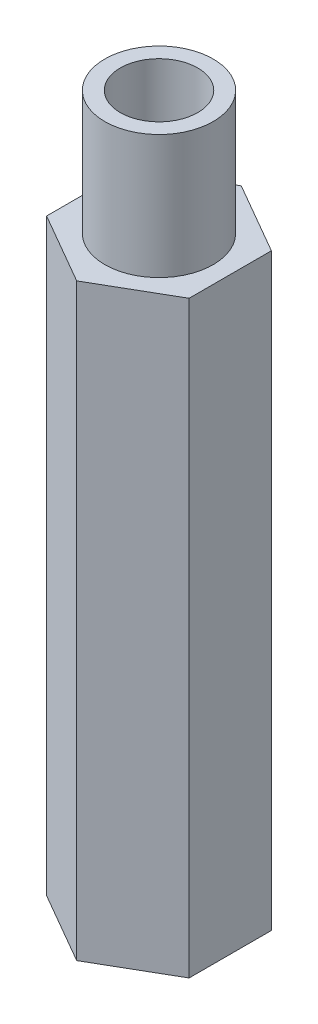
ISO-10303-21;
HEADER;
FILE_DESCRIPTION(('STEP AP214'),'2;1');
FILE_NAME('part.step','',(''),(''),'','','');
FILE_SCHEMA(('AUTOMOTIVE_DESIGN { 1 0 10303 214 1 1 1 1 }'));
ENDSEC;
DATA;
#1=APPLICATION_CONTEXT('core data for automotive mechanical design processes');
#2=APPLICATION_PROTOCOL_DEFINITION('international standard','automotive_design',2000,#1);
#3=PRODUCT_CONTEXT('',#1,'mechanical');
#4=PRODUCT('Part','Part','',(#3));
#5=PRODUCT_RELATED_PRODUCT_CATEGORY('part','',(#4));
#6=PRODUCT_DEFINITION_FORMATION('','',#4);
#7=PRODUCT_DEFINITION_CONTEXT('part definition',#1,'design');
#8=PRODUCT_DEFINITION('design','',#6,#7);
#9=PRODUCT_DEFINITION_SHAPE('','',#8);
#10=(LENGTH_UNIT() NAMED_UNIT(*) SI_UNIT(.MILLI.,.METRE.));
#11=(NAMED_UNIT(*) PLANE_ANGLE_UNIT() SI_UNIT($,.RADIAN.));
#12=(NAMED_UNIT(*) SI_UNIT($,.STERADIAN.) SOLID_ANGLE_UNIT());
#13=UNCERTAINTY_MEASURE_WITH_UNIT(LENGTH_MEASURE(1.E-05),#10,'distance_accuracy_value','');
#14=(GEOMETRIC_REPRESENTATION_CONTEXT(3) GLOBAL_UNCERTAINTY_ASSIGNED_CONTEXT((#13)) GLOBAL_UNIT_ASSIGNED_CONTEXT((#10,
#11,#12)) REPRESENTATION_CONTEXT('',''));
#15=CARTESIAN_POINT('',(0.,0.,0.));
#16=DIRECTION('',(0.,0.,1.));
#17=DIRECTION('',(1.,0.,0.));
#18=AXIS2_PLACEMENT_3D('',#15,#16,#17);
#19=CARTESIAN_POINT('',(2.29999999999999,19.,-1.32790561913617));
#20=DIRECTION('',(-0.499999999999995,0.,0.866025403784442));
#21=DIRECTION('',(0.866025403784442,0.,0.499999999999995));
#22=AXIS2_PLACEMENT_3D('',#19,#20,#21);
#23=PLANE('',#22);
#24=DIRECTION('',(-0.866025403784442,0.,-0.499999999999995));
#25=VECTOR('',#24,1.);
#26=CARTESIAN_POINT('',(2.29999999999999,0.,-1.32790561913617));
#27=LINE('',#26,#25);
#28=CARTESIAN_POINT('',(2.29999999999999,0.,-1.32790561913617));
#29=VERTEX_POINT('',#28);
#30=CARTESIAN_POINT('',(0.,0.,-2.65581123827228));
#31=VERTEX_POINT('',#30);
#32=EDGE_CURVE('E128',#29,#31,#27,.T.);
#33=ORIENTED_EDGE('',*,*,#32,.T.);
#34=DIRECTION('',(0.,-1.,0.));
#35=VECTOR('',#34,1.);
#36=CARTESIAN_POINT('',(0.,19.,-2.65581123827228));
#37=LINE('',#36,#35);
#38=CARTESIAN_POINT('',(0.,19.,-2.65581123827228));
#39=VERTEX_POINT('',#38);
#40=EDGE_CURVE('E45',#39,#31,#37,.T.);
#41=ORIENTED_EDGE('',*,*,#40,.F.);
#42=DIRECTION('',(-0.866025403784442,0.,-0.499999999999995));
#43=VECTOR('',#42,1.);
#44=CARTESIAN_POINT('',(2.29999999999999,19.,-1.32790561913617));
#45=LINE('',#44,#43);
#46=CARTESIAN_POINT('',(2.29999999999999,19.,-1.32790561913617));
#47=VERTEX_POINT('',#46);
#48=EDGE_CURVE('E139',#47,#39,#45,.T.);
#49=ORIENTED_EDGE('',*,*,#48,.F.);
#50=DIRECTION('',(0.,-1.,0.));
#51=VECTOR('',#50,1.);
#52=CARTESIAN_POINT('',(2.29999999999999,19.,-1.32790561913617));
#53=LINE('',#52,#51);
#54=EDGE_CURVE('E124',#47,#29,#53,.T.);
#55=ORIENTED_EDGE('',*,*,#54,.T.);
#56=EDGE_LOOP('',(#33,#41,#49,#55));
#57=FACE_BOUND('',#56,.T.);
#58=ADVANCED_FACE('F42',(#57),#23,.F.);
#59=CARTESIAN_POINT('',(0.,19.,-2.65581123827228));
#60=DIRECTION('',(0.500000000000001,0.,0.866025403784438));
#61=DIRECTION('',(0.866025403784438,0.,-0.500000000000001));
#62=AXIS2_PLACEMENT_3D('',#59,#60,#61);
#63=PLANE('',#62);
#64=DIRECTION('',(-0.866025403784438,0.,0.500000000000001));
#65=VECTOR('',#64,1.);
#66=CARTESIAN_POINT('',(0.,0.,-2.65581123827228));
#67=LINE('',#66,#65);
#68=CARTESIAN_POINT('',(-2.3,0.,-1.32790561913613));
#69=VERTEX_POINT('',#68);
#70=EDGE_CURVE('E131',#31,#69,#67,.T.);
#71=ORIENTED_EDGE('',*,*,#70,.T.);
#72=DIRECTION('',(0.,-1.,0.));
#73=VECTOR('',#72,1.);
#74=CARTESIAN_POINT('',(-2.3,19.,-1.32790561913613));
#75=LINE('',#74,#73);
#76=CARTESIAN_POINT('',(-2.3,19.,-1.32790561913613));
#77=VERTEX_POINT('',#76);
#78=EDGE_CURVE('E142',#77,#69,#75,.T.);
#79=ORIENTED_EDGE('',*,*,#78,.F.);
#80=DIRECTION('',(-0.866025403784438,0.,0.500000000000001));
#81=VECTOR('',#80,1.);
#82=CARTESIAN_POINT('',(0.,19.,-2.65581123827228));
#83=LINE('',#82,#81);
#84=EDGE_CURVE('E97',#39,#77,#83,.T.);
#85=ORIENTED_EDGE('',*,*,#84,.F.);
#86=ORIENTED_EDGE('',*,*,#40,.T.);
#87=EDGE_LOOP('',(#71,#79,#85,#86));
#88=FACE_BOUND('',#87,.T.);
#89=ADVANCED_FACE('F147',(#88),#63,.F.);
#90=CARTESIAN_POINT('',(-2.3,19.,-1.32790561913613));
#91=DIRECTION('',(1.,0.,0.));
#92=DIRECTION('',(0.,0.,-1.));
#93=AXIS2_PLACEMENT_3D('',#90,#91,#92);
#94=PLANE('',#93);
#95=DIRECTION('',(0.,0.,1.));
#96=VECTOR('',#95,1.);
#97=CARTESIAN_POINT('',(-2.3,0.,-1.32790561913613));
#98=LINE('',#97,#96);
#99=CARTESIAN_POINT('',(-2.3,0.,1.32790561913615));
#100=VERTEX_POINT('',#99);
#101=EDGE_CURVE('E134',#69,#100,#98,.T.);
#102=ORIENTED_EDGE('',*,*,#101,.T.);
#103=DIRECTION('',(0.,-1.,0.));
#104=VECTOR('',#103,1.);
#105=CARTESIAN_POINT('',(-2.3,19.,1.32790561913615));
#106=LINE('',#105,#104);
#107=CARTESIAN_POINT('',(-2.3,19.,1.32790561913615));
#108=VERTEX_POINT('',#107);
#109=EDGE_CURVE('E119',#108,#100,#106,.T.);
#110=ORIENTED_EDGE('',*,*,#109,.F.);
#111=DIRECTION('',(0.,0.,1.));
#112=VECTOR('',#111,1.);
#113=CARTESIAN_POINT('',(-2.3,19.,-1.32790561913613));
#114=LINE('',#113,#112);
#115=EDGE_CURVE('E110',#77,#108,#114,.T.);
#116=ORIENTED_EDGE('',*,*,#115,.F.);
#117=ORIENTED_EDGE('',*,*,#78,.T.);
#118=EDGE_LOOP('',(#102,#110,#116,#117));
#119=FACE_BOUND('',#118,.T.);
#120=ADVANCED_FACE('F153',(#119),#94,.F.);
#121=CARTESIAN_POINT('',(-2.3,19.,1.32790561913615));
#122=DIRECTION('',(0.499999999999995,0.,-0.866025403784442));
#123=DIRECTION('',(-0.866025403784442,0.,-0.499999999999995));
#124=AXIS2_PLACEMENT_3D('',#121,#122,#123);
#125=PLANE('',#124);
#126=DIRECTION('',(0.866025403784442,0.,0.499999999999995));
#127=VECTOR('',#126,1.);
#128=CARTESIAN_POINT('',(-2.3,0.,1.32790561913615));
#129=LINE('',#128,#127);
#130=CARTESIAN_POINT('',(0.,0.,2.65581123827228));
#131=VERTEX_POINT('',#130);
#132=EDGE_CURVE('E118',#100,#131,#129,.T.);
#133=ORIENTED_EDGE('',*,*,#132,.T.);
#134=DIRECTION('',(0.,-1.,0.));
#135=VECTOR('',#134,1.);
#136=CARTESIAN_POINT('',(0.,19.,2.65581123827228));
#137=LINE('',#136,#135);
#138=CARTESIAN_POINT('',(0.,19.,2.65581123827228));
#139=VERTEX_POINT('',#138);
#140=EDGE_CURVE('E115',#139,#131,#137,.T.);
#141=ORIENTED_EDGE('',*,*,#140,.F.);
#142=DIRECTION('',(0.866025403784442,0.,0.499999999999995));
#143=VECTOR('',#142,1.);
#144=CARTESIAN_POINT('',(-2.3,19.,1.32790561913615));
#145=LINE('',#144,#143);
#146=EDGE_CURVE('E104',#108,#139,#145,.T.);
#147=ORIENTED_EDGE('',*,*,#146,.F.);
#148=ORIENTED_EDGE('',*,*,#109,.T.);
#149=EDGE_LOOP('',(#133,#141,#147,#148));
#150=FACE_BOUND('',#149,.T.);
#151=ADVANCED_FACE('F116',(#150),#125,.F.);
#152=CARTESIAN_POINT('',(0.,19.,2.65581123827228));
#153=DIRECTION('',(-0.500000000000007,0.,-0.866025403784435));
#154=DIRECTION('',(-0.866025403784434,0.,0.500000000000007));
#155=AXIS2_PLACEMENT_3D('',#152,#153,#154);
#156=PLANE('',#155);
#157=DIRECTION('',(0.866025403784435,0.,-0.500000000000007));
#158=VECTOR('',#157,1.);
#159=CARTESIAN_POINT('',(0.,0.,2.65581123827228));
#160=LINE('',#159,#158);
#161=CARTESIAN_POINT('',(2.30000000000001,0.,1.32790561913612));
#162=VERTEX_POINT('',#161);
#163=EDGE_CURVE('E82',#131,#162,#160,.T.);
#164=ORIENTED_EDGE('',*,*,#163,.T.);
#165=DIRECTION('',(0.,-1.,0.));
#166=VECTOR('',#165,1.);
#167=CARTESIAN_POINT('',(2.30000000000001,19.,1.32790561913612));
#168=LINE('',#167,#166);
#169=CARTESIAN_POINT('',(2.30000000000001,19.,1.32790561913612));
#170=VERTEX_POINT('',#169);
#171=EDGE_CURVE('E120',#170,#162,#168,.T.);
#172=ORIENTED_EDGE('',*,*,#171,.F.);
#173=DIRECTION('',(0.866025403784435,0.,-0.500000000000007));
#174=VECTOR('',#173,1.);
#175=CARTESIAN_POINT('',(0.,19.,2.65581123827228));
#176=LINE('',#175,#174);
#177=EDGE_CURVE('E108',#139,#170,#176,.T.);
#178=ORIENTED_EDGE('',*,*,#177,.F.);
#179=ORIENTED_EDGE('',*,*,#140,.T.);
#180=EDGE_LOOP('',(#164,#172,#178,#179));
#181=FACE_BOUND('',#180,.T.);
#182=ADVANCED_FACE('F122',(#181),#156,.F.);
#183=CARTESIAN_POINT('',(2.30000000000001,19.,1.32790561913612));
#184=DIRECTION('',(-1.,0.,0.));
#185=DIRECTION('',(0.,0.,1.));
#186=AXIS2_PLACEMENT_3D('',#183,#184,#185);
#187=PLANE('',#186);
#188=DIRECTION('',(0.,0.,-1.));
#189=VECTOR('',#188,1.);
#190=CARTESIAN_POINT('',(2.30000000000001,0.,1.32790561913612));
#191=LINE('',#190,#189);
#192=EDGE_CURVE('E88',#162,#29,#191,.T.);
#193=ORIENTED_EDGE('',*,*,#192,.T.);
#194=ORIENTED_EDGE('',*,*,#54,.F.);
#195=DIRECTION('',(0.,0.,-1.));
#196=VECTOR('',#195,1.);
#197=CARTESIAN_POINT('',(2.30000000000001,19.,1.32790561913612));
#198=LINE('',#197,#196);
#199=EDGE_CURVE('E59',#170,#47,#198,.T.);
#200=ORIENTED_EDGE('',*,*,#199,.F.);
#201=ORIENTED_EDGE('',*,*,#171,.T.);
#202=EDGE_LOOP('',(#193,#194,#200,#201));
#203=FACE_BOUND('',#202,.T.);
#204=ADVANCED_FACE('F181',(#203),#187,.F.);
#205=CARTESIAN_POINT('',(0.,19.,0.));
#206=DIRECTION('',(0.,1.,0.));
#207=DIRECTION('',(0.,0.,1.));
#208=AXIS2_PLACEMENT_3D('',#205,#206,#207);
#209=PLANE('',#208);
#210=CARTESIAN_POINT('',(0.,19.,0.));
#211=DIRECTION('',(0.,1.,0.));
#212=DIRECTION('',(0.,0.,1.));
#213=AXIS2_PLACEMENT_3D('',#210,#211,#212);
#214=CIRCLE('',#213,1.75);
#215=CARTESIAN_POINT('',(0.,19.,1.75));
#216=VERTEX_POINT('',#215);
#217=EDGE_CURVE('E11',#216,#216,#214,.T.);
#218=ORIENTED_EDGE('',*,*,#217,.F.);
#219=EDGE_LOOP('',(#218));
#220=FACE_BOUND('',#219,.T.);
#221=ORIENTED_EDGE('',*,*,#48,.T.);
#222=ORIENTED_EDGE('',*,*,#84,.T.);
#223=ORIENTED_EDGE('',*,*,#115,.T.);
#224=ORIENTED_EDGE('',*,*,#146,.T.);
#225=ORIENTED_EDGE('',*,*,#177,.T.);
#226=ORIENTED_EDGE('',*,*,#199,.T.);
#227=EDGE_LOOP('',(#221,#222,#223,#224,#225,#226));
#228=FACE_BOUND('',#227,.T.);
#229=ADVANCED_FACE('F106',(#220,#228),#209,.T.);
#230=CARTESIAN_POINT('',(0.,0.,0.));
#231=DIRECTION('',(0.,1.,0.));
#232=DIRECTION('',(0.,0.,1.));
#233=AXIS2_PLACEMENT_3D('',#230,#231,#232);
#234=PLANE('',#233);
#235=CARTESIAN_POINT('',(0.,0.,0.));
#236=DIRECTION('',(0.,1.,0.));
#237=DIRECTION('',(0.,0.,1.));
#238=AXIS2_PLACEMENT_3D('',#235,#236,#237);
#239=CIRCLE('',#238,1.24999999999999);
#240=CARTESIAN_POINT('',(0.,0.,1.24999999999999));
#241=VERTEX_POINT('',#240);
#242=EDGE_CURVE('E159',#241,#241,#239,.T.);
#243=ORIENTED_EDGE('',*,*,#242,.T.);
#244=EDGE_LOOP('',(#243));
#245=FACE_BOUND('',#244,.T.);
#246=ORIENTED_EDGE('',*,*,#32,.F.);
#247=ORIENTED_EDGE('',*,*,#192,.F.);
#248=ORIENTED_EDGE('',*,*,#163,.F.);
#249=ORIENTED_EDGE('',*,*,#132,.F.);
#250=ORIENTED_EDGE('',*,*,#101,.F.);
#251=ORIENTED_EDGE('',*,*,#70,.F.);
#252=EDGE_LOOP('',(#246,#247,#248,#249,#250,#251));
#253=FACE_BOUND('',#252,.T.);
#254=ADVANCED_FACE('F152',(#245,#253),#234,.F.);
#255=CARTESIAN_POINT('',(0.,23.,0.));
#256=DIRECTION('',(0.,-1.,0.));
#257=DIRECTION('',(0.,0.,-1.));
#258=AXIS2_PLACEMENT_3D('',#255,#256,#257);
#259=CYLINDRICAL_SURFACE('',#258,1.75);
#260=CARTESIAN_POINT('',(0.,23.,0.));
#261=DIRECTION('',(0.,1.,0.));
#262=DIRECTION('',(0.,0.,1.));
#263=AXIS2_PLACEMENT_3D('',#260,#261,#262);
#264=CIRCLE('',#263,1.75);
#265=CARTESIAN_POINT('',(0.,23.,1.75));
#266=VERTEX_POINT('',#265);
#267=EDGE_CURVE('E132',#266,#266,#264,.T.);
#268=ORIENTED_EDGE('',*,*,#267,.F.);
#269=EDGE_LOOP('',(#268));
#270=FACE_BOUND('',#269,.T.);
#271=ORIENTED_EDGE('',*,*,#217,.T.);
#272=EDGE_LOOP('',(#271));
#273=FACE_BOUND('',#272,.T.);
#274=ADVANCED_FACE('F171',(#270,#273),#259,.T.);
#275=CARTESIAN_POINT('',(0.,23.,0.));
#276=DIRECTION('',(0.,1.,0.));
#277=DIRECTION('',(0.,0.,1.));
#278=AXIS2_PLACEMENT_3D('',#275,#276,#277);
#279=PLANE('',#278);
#280=CARTESIAN_POINT('',(0.,23.,0.));
#281=DIRECTION('',(0.,1.,0.));
#282=DIRECTION('',(0.,0.,1.));
#283=AXIS2_PLACEMENT_3D('',#280,#281,#282);
#284=CIRCLE('',#283,1.25);
#285=CARTESIAN_POINT('',(0.,23.,1.25));
#286=VERTEX_POINT('',#285);
#287=EDGE_CURVE('E162',#286,#286,#284,.T.);
#288=ORIENTED_EDGE('',*,*,#287,.F.);
#289=EDGE_LOOP('',(#288));
#290=FACE_BOUND('',#289,.T.);
#291=ORIENTED_EDGE('',*,*,#267,.T.);
#292=EDGE_LOOP('',(#291));
#293=FACE_BOUND('',#292,.T.);
#294=ADVANCED_FACE('F168',(#290,#293),#279,.T.);
#295=CARTESIAN_POINT('',(0.,23.,0.));
#296=DIRECTION('',(0.,1.,0.));
#297=DIRECTION('',(0.,0.,1.));
#298=AXIS2_PLACEMENT_3D('',#295,#296,#297);
#299=CYLINDRICAL_SURFACE('',#298,1.25);
#300=ORIENTED_EDGE('',*,*,#242,.F.);
#301=EDGE_LOOP('',(#300));
#302=FACE_BOUND('',#301,.T.);
#303=ORIENTED_EDGE('',*,*,#287,.T.);
#304=EDGE_LOOP('',(#303));
#305=FACE_BOUND('',#304,.T.);
#306=ADVANCED_FACE('F166',(#302,#305),#299,.F.);
#307=CLOSED_SHELL('',(#58,#89,#120,#151,#182,#204,#229,#254,#274,#294,#306));
#308=MANIFOLD_SOLID_BREP('B2',#307);
#309=ADVANCED_BREP_SHAPE_REPRESENTATION('',(#18,#308),#14);
#310=SHAPE_DEFINITION_REPRESENTATION(#9,#309);
ENDSEC;
END-ISO-10303-21;
